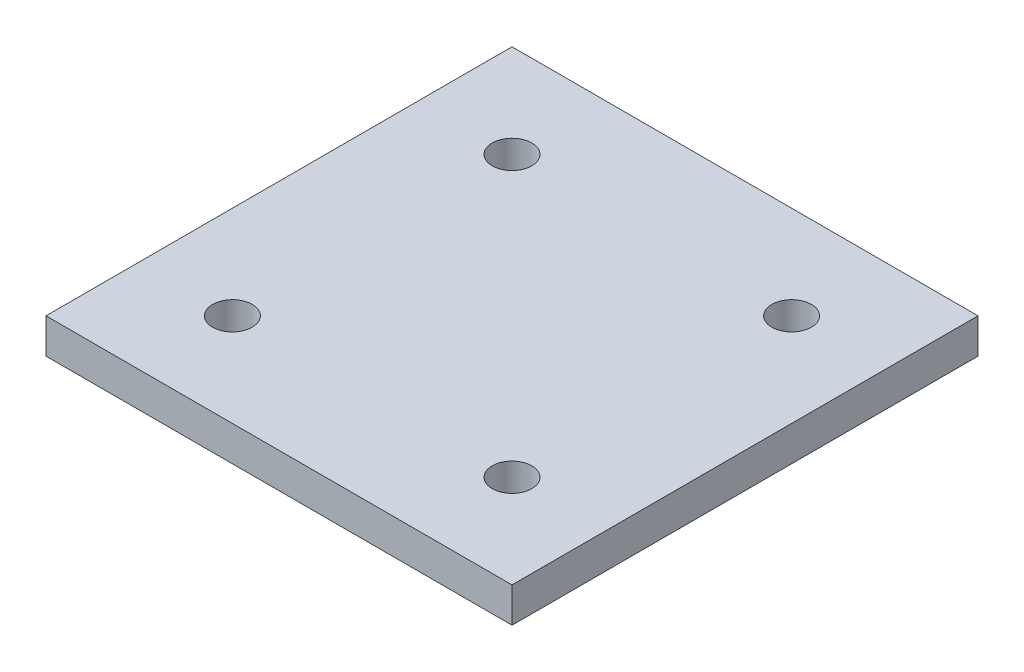
ISO-10303-21;
HEADER;
FILE_DESCRIPTION(('STEP AP214'),'2;1');
FILE_NAME('part.step','',(''),(''),'','','');
FILE_SCHEMA(('AUTOMOTIVE_DESIGN { 1 0 10303 214 1 1 1 1 }'));
ENDSEC;
DATA;
#1=APPLICATION_CONTEXT('core data for automotive mechanical design processes');
#2=APPLICATION_PROTOCOL_DEFINITION('international standard','automotive_design',2000,#1);
#3=PRODUCT_CONTEXT('',#1,'mechanical');
#4=PRODUCT('Part','Part','',(#3));
#5=PRODUCT_RELATED_PRODUCT_CATEGORY('part','',(#4));
#6=PRODUCT_DEFINITION_FORMATION('','',#4);
#7=PRODUCT_DEFINITION_CONTEXT('part definition',#1,'design');
#8=PRODUCT_DEFINITION('design','',#6,#7);
#9=PRODUCT_DEFINITION_SHAPE('','',#8);
#10=(LENGTH_UNIT() NAMED_UNIT(*) SI_UNIT(.MILLI.,.METRE.));
#11=(NAMED_UNIT(*) PLANE_ANGLE_UNIT() SI_UNIT($,.RADIAN.));
#12=(NAMED_UNIT(*) SI_UNIT($,.STERADIAN.) SOLID_ANGLE_UNIT());
#13=UNCERTAINTY_MEASURE_WITH_UNIT(LENGTH_MEASURE(1.E-05),#10,'distance_accuracy_value','');
#14=(GEOMETRIC_REPRESENTATION_CONTEXT(3) GLOBAL_UNCERTAINTY_ASSIGNED_CONTEXT((#13)) GLOBAL_UNIT_ASSIGNED_CONTEXT((#10,
#11,#12)) REPRESENTATION_CONTEXT('',''));
#15=CARTESIAN_POINT('',(0.,0.,0.));
#16=DIRECTION('',(0.,0.,1.));
#17=DIRECTION('',(1.,0.,0.));
#18=AXIS2_PLACEMENT_3D('',#15,#16,#17);
#19=CARTESIAN_POINT('',(-20.,3.,20.));
#20=DIRECTION('',(1.,0.,0.));
#21=DIRECTION('',(0.,0.,-1.));
#22=AXIS2_PLACEMENT_3D('',#19,#20,#21);
#23=PLANE('',#22);
#24=DIRECTION('',(0.,0.,1.));
#25=VECTOR('',#24,1.);
#26=CARTESIAN_POINT('',(-20.,0.,20.));
#27=LINE('',#26,#25);
#28=CARTESIAN_POINT('',(-20.,0.,-20.));
#29=VERTEX_POINT('',#28);
#30=CARTESIAN_POINT('',(-20.,0.,20.));
#31=VERTEX_POINT('',#30);
#32=EDGE_CURVE('E105',#29,#31,#27,.T.);
#33=ORIENTED_EDGE('',*,*,#32,.T.);
#34=DIRECTION('',(0.,-1.,0.));
#35=VECTOR('',#34,1.);
#36=CARTESIAN_POINT('',(-20.,3.,20.));
#37=LINE('',#36,#35);
#38=CARTESIAN_POINT('',(-20.,3.,20.));
#39=VERTEX_POINT('',#38);
#40=EDGE_CURVE('E11',#39,#31,#37,.T.);
#41=ORIENTED_EDGE('',*,*,#40,.F.);
#42=DIRECTION('',(0.,0.,1.));
#43=VECTOR('',#42,1.);
#44=CARTESIAN_POINT('',(-20.,3.,20.));
#45=LINE('',#44,#43);
#46=CARTESIAN_POINT('',(-20.,3.,-20.));
#47=VERTEX_POINT('',#46);
#48=EDGE_CURVE('E92',#47,#39,#45,.T.);
#49=ORIENTED_EDGE('',*,*,#48,.F.);
#50=DIRECTION('',(0.,-1.,0.));
#51=VECTOR('',#50,1.);
#52=CARTESIAN_POINT('',(-20.,3.,-20.));
#53=LINE('',#52,#51);
#54=EDGE_CURVE('E101',#47,#29,#53,.T.);
#55=ORIENTED_EDGE('',*,*,#54,.T.);
#56=EDGE_LOOP('',(#33,#41,#49,#55));
#57=FACE_BOUND('',#56,.T.);
#58=ADVANCED_FACE('F39',(#57),#23,.F.);
#59=CARTESIAN_POINT('',(-20.,3.,20.));
#60=DIRECTION('',(0.,0.,-1.));
#61=DIRECTION('',(-1.,0.,0.));
#62=AXIS2_PLACEMENT_3D('',#59,#60,#61);
#63=PLANE('',#62);
#64=DIRECTION('',(1.,0.,0.));
#65=VECTOR('',#64,1.);
#66=CARTESIAN_POINT('',(-20.,0.,20.));
#67=LINE('',#66,#65);
#68=CARTESIAN_POINT('',(20.,0.,20.));
#69=VERTEX_POINT('',#68);
#70=EDGE_CURVE('E96',#31,#69,#67,.T.);
#71=ORIENTED_EDGE('',*,*,#70,.T.);
#72=DIRECTION('',(0.,-1.,0.));
#73=VECTOR('',#72,1.);
#74=CARTESIAN_POINT('',(20.,3.,20.));
#75=LINE('',#74,#73);
#76=CARTESIAN_POINT('',(20.,3.,20.));
#77=VERTEX_POINT('',#76);
#78=EDGE_CURVE('E48',#77,#69,#75,.T.);
#79=ORIENTED_EDGE('',*,*,#78,.F.);
#80=DIRECTION('',(1.,0.,0.));
#81=VECTOR('',#80,1.);
#82=CARTESIAN_POINT('',(-20.,3.,20.));
#83=LINE('',#82,#81);
#84=EDGE_CURVE('E87',#39,#77,#83,.T.);
#85=ORIENTED_EDGE('',*,*,#84,.F.);
#86=ORIENTED_EDGE('',*,*,#40,.T.);
#87=EDGE_LOOP('',(#71,#79,#85,#86));
#88=FACE_BOUND('',#87,.T.);
#89=ADVANCED_FACE('F95',(#88),#63,.F.);
#90=CARTESIAN_POINT('',(20.,3.,20.));
#91=DIRECTION('',(-1.,0.,0.));
#92=DIRECTION('',(0.,0.,1.));
#93=AXIS2_PLACEMENT_3D('',#90,#91,#92);
#94=PLANE('',#93);
#95=DIRECTION('',(0.,0.,-1.));
#96=VECTOR('',#95,1.);
#97=CARTESIAN_POINT('',(20.,0.,20.));
#98=LINE('',#97,#96);
#99=CARTESIAN_POINT('',(20.,0.,-20.));
#100=VERTEX_POINT('',#99);
#101=EDGE_CURVE('E74',#69,#100,#98,.T.);
#102=ORIENTED_EDGE('',*,*,#101,.T.);
#103=DIRECTION('',(0.,-1.,0.));
#104=VECTOR('',#103,1.);
#105=CARTESIAN_POINT('',(20.,3.,-20.));
#106=LINE('',#105,#104);
#107=CARTESIAN_POINT('',(20.,3.,-20.));
#108=VERTEX_POINT('',#107);
#109=EDGE_CURVE('E97',#108,#100,#106,.T.);
#110=ORIENTED_EDGE('',*,*,#109,.F.);
#111=DIRECTION('',(0.,0.,-1.));
#112=VECTOR('',#111,1.);
#113=CARTESIAN_POINT('',(20.,3.,20.));
#114=LINE('',#113,#112);
#115=EDGE_CURVE('E90',#77,#108,#114,.T.);
#116=ORIENTED_EDGE('',*,*,#115,.F.);
#117=ORIENTED_EDGE('',*,*,#78,.T.);
#118=EDGE_LOOP('',(#102,#110,#116,#117));
#119=FACE_BOUND('',#118,.T.);
#120=ADVANCED_FACE('F99',(#119),#94,.F.);
#121=CARTESIAN_POINT('',(-20.,3.,-20.));
#122=DIRECTION('',(0.,0.,1.));
#123=DIRECTION('',(1.,0.,0.));
#124=AXIS2_PLACEMENT_3D('',#121,#122,#123);
#125=PLANE('',#124);
#126=DIRECTION('',(-1.,0.,0.));
#127=VECTOR('',#126,1.);
#128=CARTESIAN_POINT('',(-20.,0.,-20.));
#129=LINE('',#128,#127);
#130=EDGE_CURVE('E80',#100,#29,#129,.T.);
#131=ORIENTED_EDGE('',*,*,#130,.T.);
#132=ORIENTED_EDGE('',*,*,#54,.F.);
#133=DIRECTION('',(-1.,0.,0.));
#134=VECTOR('',#133,1.);
#135=CARTESIAN_POINT('',(-20.,3.,-20.));
#136=LINE('',#135,#134);
#137=EDGE_CURVE('E57',#108,#47,#136,.T.);
#138=ORIENTED_EDGE('',*,*,#137,.F.);
#139=ORIENTED_EDGE('',*,*,#109,.T.);
#140=EDGE_LOOP('',(#131,#132,#138,#139));
#141=FACE_BOUND('',#140,.T.);
#142=ADVANCED_FACE('F141',(#141),#125,.F.);
#143=CARTESIAN_POINT('',(0.,3.,0.));
#144=DIRECTION('',(0.,-1.,0.));
#145=DIRECTION('',(0.,0.,-1.));
#146=AXIS2_PLACEMENT_3D('',#143,#144,#145);
#147=PLANE('',#146);
#148=CARTESIAN_POINT('',(-12.,3.,-12.));
#149=DIRECTION('',(0.,1.,0.));
#150=DIRECTION('',(0.,0.,1.));
#151=AXIS2_PLACEMENT_3D('',#148,#149,#150);
#152=CIRCLE('',#151,1.7);
#153=CARTESIAN_POINT('',(-12.,3.,-10.3));
#154=VERTEX_POINT('',#153);
#155=EDGE_CURVE('E223',#154,#154,#152,.T.);
#156=ORIENTED_EDGE('',*,*,#155,.F.);
#157=EDGE_LOOP('',(#156));
#158=FACE_BOUND('',#157,.T.);
#159=CARTESIAN_POINT('',(12.,3.,12.));
#160=DIRECTION('',(0.,1.,0.));
#161=DIRECTION('',(0.,0.,1.));
#162=AXIS2_PLACEMENT_3D('',#159,#160,#161);
#163=CIRCLE('',#162,1.7);
#164=CARTESIAN_POINT('',(12.,3.,13.7));
#165=VERTEX_POINT('',#164);
#166=EDGE_CURVE('E221',#165,#165,#163,.T.);
#167=ORIENTED_EDGE('',*,*,#166,.F.);
#168=EDGE_LOOP('',(#167));
#169=FACE_BOUND('',#168,.T.);
#170=CARTESIAN_POINT('',(12.,3.,-12.));
#171=DIRECTION('',(0.,1.,0.));
#172=DIRECTION('',(0.,0.,1.));
#173=AXIS2_PLACEMENT_3D('',#170,#171,#172);
#174=CIRCLE('',#173,1.7);
#175=CARTESIAN_POINT('',(12.,3.,-10.3));
#176=VERTEX_POINT('',#175);
#177=EDGE_CURVE('E224',#176,#176,#174,.T.);
#178=ORIENTED_EDGE('',*,*,#177,.F.);
#179=EDGE_LOOP('',(#178));
#180=FACE_BOUND('',#179,.T.);
#181=CARTESIAN_POINT('',(-12.,3.,12.));
#182=DIRECTION('',(0.,1.,0.));
#183=DIRECTION('',(0.,0.,1.));
#184=AXIS2_PLACEMENT_3D('',#181,#182,#183);
#185=CIRCLE('',#184,1.7);
#186=CARTESIAN_POINT('',(-12.,3.,13.7));
#187=VERTEX_POINT('',#186);
#188=EDGE_CURVE('E117',#187,#187,#185,.T.);
#189=ORIENTED_EDGE('',*,*,#188,.F.);
#190=EDGE_LOOP('',(#189));
#191=FACE_BOUND('',#190,.T.);
#192=ORIENTED_EDGE('',*,*,#48,.T.);
#193=ORIENTED_EDGE('',*,*,#84,.T.);
#194=ORIENTED_EDGE('',*,*,#115,.T.);
#195=ORIENTED_EDGE('',*,*,#137,.T.);
#196=EDGE_LOOP('',(#192,#193,#194,#195));
#197=FACE_BOUND('',#196,.T.);
#198=ADVANCED_FACE('F88',(#158,#169,#180,#191,#197),#147,.F.);
#199=CARTESIAN_POINT('',(0.,0.,0.));
#200=DIRECTION('',(0.,-1.,0.));
#201=DIRECTION('',(0.,0.,-1.));
#202=AXIS2_PLACEMENT_3D('',#199,#200,#201);
#203=PLANE('',#202);
#204=CARTESIAN_POINT('',(-12.,0.,-12.));
#205=DIRECTION('',(0.,-1.,0.));
#206=DIRECTION('',(0.,0.,-1.));
#207=AXIS2_PLACEMENT_3D('',#204,#205,#206);
#208=CIRCLE('',#207,1.7);
#209=CARTESIAN_POINT('',(-12.,0.,-10.3));
#210=VERTEX_POINT('',#209);
#211=EDGE_CURVE('E42',#210,#210,#208,.T.);
#212=ORIENTED_EDGE('',*,*,#211,.F.);
#213=EDGE_LOOP('',(#212));
#214=FACE_BOUND('',#213,.T.);
#215=CARTESIAN_POINT('',(12.,0.,12.));
#216=DIRECTION('',(0.,-1.,0.));
#217=DIRECTION('',(0.,0.,-1.));
#218=AXIS2_PLACEMENT_3D('',#215,#216,#217);
#219=CIRCLE('',#218,1.7);
#220=CARTESIAN_POINT('',(12.,0.,13.7));
#221=VERTEX_POINT('',#220);
#222=EDGE_CURVE('E119',#221,#221,#219,.T.);
#223=ORIENTED_EDGE('',*,*,#222,.F.);
#224=EDGE_LOOP('',(#223));
#225=FACE_BOUND('',#224,.T.);
#226=CARTESIAN_POINT('',(12.,0.,-12.));
#227=DIRECTION('',(0.,-1.,0.));
#228=DIRECTION('',(0.,0.,-1.));
#229=AXIS2_PLACEMENT_3D('',#226,#227,#228);
#230=CIRCLE('',#229,1.7);
#231=CARTESIAN_POINT('',(12.,0.,-10.3));
#232=VERTEX_POINT('',#231);
#233=EDGE_CURVE('E116',#232,#232,#230,.T.);
#234=ORIENTED_EDGE('',*,*,#233,.F.);
#235=EDGE_LOOP('',(#234));
#236=FACE_BOUND('',#235,.T.);
#237=CARTESIAN_POINT('',(-12.,0.,12.));
#238=DIRECTION('',(0.,-1.,0.));
#239=DIRECTION('',(0.,0.,-1.));
#240=AXIS2_PLACEMENT_3D('',#237,#238,#239);
#241=CIRCLE('',#240,1.7);
#242=CARTESIAN_POINT('',(-12.,0.,13.7));
#243=VERTEX_POINT('',#242);
#244=EDGE_CURVE('E113',#243,#243,#241,.T.);
#245=ORIENTED_EDGE('',*,*,#244,.F.);
#246=EDGE_LOOP('',(#245));
#247=FACE_BOUND('',#246,.T.);
#248=ORIENTED_EDGE('',*,*,#32,.F.);
#249=ORIENTED_EDGE('',*,*,#130,.F.);
#250=ORIENTED_EDGE('',*,*,#101,.F.);
#251=ORIENTED_EDGE('',*,*,#70,.F.);
#252=EDGE_LOOP('',(#248,#249,#250,#251));
#253=FACE_BOUND('',#252,.T.);
#254=ADVANCED_FACE('F129',(#214,#225,#236,#247,#253),#203,.T.);
#255=CARTESIAN_POINT('',(-12.,-1.2E-05,12.));
#256=DIRECTION('',(0.,1.,0.));
#257=DIRECTION('',(0.,0.,1.));
#258=AXIS2_PLACEMENT_3D('',#255,#256,#257);
#259=CYLINDRICAL_SURFACE('',#258,1.7);
#260=CARTESIAN_POINT('',(-12.,0.,13.7));
#261=CARTESIAN_POINT('',(-12.,0.03125,13.7));
#262=CARTESIAN_POINT('',(-12.,0.0625,13.7));
#263=CARTESIAN_POINT('',(-12.,0.125,13.7));
#264=CARTESIAN_POINT('',(-12.,0.15625,13.7));
#265=CARTESIAN_POINT('',(-12.,0.21875,13.7));
#266=CARTESIAN_POINT('',(-12.,0.25,13.7));
#267=CARTESIAN_POINT('',(-12.,0.3125,13.7));
#268=CARTESIAN_POINT('',(-12.,0.34375,13.7));
#269=CARTESIAN_POINT('',(-12.,0.40625,13.7));
#270=CARTESIAN_POINT('',(-12.,0.4375,13.7));
#271=CARTESIAN_POINT('',(-12.,0.5,13.7));
#272=CARTESIAN_POINT('',(-12.,0.53125,13.7));
#273=CARTESIAN_POINT('',(-12.,0.59375,13.7));
#274=CARTESIAN_POINT('',(-12.,0.625,13.7));
#275=CARTESIAN_POINT('',(-12.,0.6875,13.7));
#276=CARTESIAN_POINT('',(-12.,0.71875,13.7));
#277=CARTESIAN_POINT('',(-12.,0.78125,13.7));
#278=CARTESIAN_POINT('',(-12.,0.8125,13.7));
#279=CARTESIAN_POINT('',(-12.,0.875,13.7));
#280=CARTESIAN_POINT('',(-12.,0.90625,13.7));
#281=CARTESIAN_POINT('',(-12.,0.96875,13.7));
#282=CARTESIAN_POINT('',(-12.,1.,13.7));
#283=CARTESIAN_POINT('',(-12.,1.0625,13.7));
#284=CARTESIAN_POINT('',(-12.,1.09375,13.7));
#285=CARTESIAN_POINT('',(-12.,1.15625,13.7));
#286=CARTESIAN_POINT('',(-12.,1.1875,13.7));
#287=CARTESIAN_POINT('',(-12.,1.25,13.7));
#288=CARTESIAN_POINT('',(-12.,1.28125,13.7));
#289=CARTESIAN_POINT('',(-12.,1.34375,13.7));
#290=CARTESIAN_POINT('',(-12.,1.375,13.7));
#291=CARTESIAN_POINT('',(-12.,1.4375,13.7));
#292=CARTESIAN_POINT('',(-12.,1.46875,13.7));
#293=CARTESIAN_POINT('',(-12.,1.53125,13.7));
#294=CARTESIAN_POINT('',(-12.,1.5625,13.7));
#295=CARTESIAN_POINT('',(-12.,1.625,13.7));
#296=CARTESIAN_POINT('',(-12.,1.65625,13.7));
#297=CARTESIAN_POINT('',(-12.,1.71875,13.7));
#298=CARTESIAN_POINT('',(-12.,1.75,13.7));
#299=CARTESIAN_POINT('',(-12.,1.8125,13.7));
#300=CARTESIAN_POINT('',(-12.,1.84375,13.7));
#301=CARTESIAN_POINT('',(-12.,1.90625,13.7));
#302=CARTESIAN_POINT('',(-12.,1.9375,13.7));
#303=CARTESIAN_POINT('',(-12.,2.,13.7));
#304=CARTESIAN_POINT('',(-12.,2.03125,13.7));
#305=CARTESIAN_POINT('',(-12.,2.09375,13.7));
#306=CARTESIAN_POINT('',(-12.,2.125,13.7));
#307=CARTESIAN_POINT('',(-12.,2.1875,13.7));
#308=CARTESIAN_POINT('',(-12.,2.21875,13.7));
#309=CARTESIAN_POINT('',(-12.,2.28125,13.7));
#310=CARTESIAN_POINT('',(-12.,2.3125,13.7));
#311=CARTESIAN_POINT('',(-12.,2.375,13.7));
#312=CARTESIAN_POINT('',(-12.,2.40625,13.7));
#313=CARTESIAN_POINT('',(-12.,2.46875,13.7));
#314=CARTESIAN_POINT('',(-12.,2.5,13.7));
#315=CARTESIAN_POINT('',(-12.,2.5625,13.7));
#316=CARTESIAN_POINT('',(-12.,2.59375,13.7));
#317=CARTESIAN_POINT('',(-12.,2.65625,13.7));
#318=CARTESIAN_POINT('',(-12.,2.6875,13.7));
#319=CARTESIAN_POINT('',(-12.,2.75,13.7));
#320=CARTESIAN_POINT('',(-12.,2.78125,13.7));
#321=CARTESIAN_POINT('',(-12.,2.84375,13.7));
#322=CARTESIAN_POINT('',(-12.,2.875,13.7));
#323=CARTESIAN_POINT('',(-12.,2.9375,13.7));
#324=CARTESIAN_POINT('',(-12.,2.96875,13.7));
#325=CARTESIAN_POINT('',(-12.,3.,13.7));
#326=B_SPLINE_CURVE_WITH_KNOTS('',3,(#260,#261,#262,#263,#264,#265,#266,#267,#268,#269,#270,
#271,#272,#273,#274,#275,#276,#277,#278,#279,#280,#281,#282,#283,#284,#285,#286,#287,#288,#289,
#290,#291,#292,#293,#294,#295,#296,#297,#298,#299,#300,#301,#302,#303,#304,#305,#306,#307,#308,
#309,#310,#311,#312,#313,#314,#315,#316,#317,#318,#319,#320,#321,#322,#323,#324,#325),
.UNSPECIFIED.,.F.,.F.,(4,2,2,2,2,2,2,2,2,2,2,2,2,2,2,2,2,2,2,2,2,2,2,2,2,2,2,2,2,2,2,2,4),(0.,
0.09375,0.1875,0.28125,0.375,0.46875,0.5625,0.65625,0.75,0.84375,0.9375,1.03125,1.125,1.21875,
1.3125,1.40625,1.5,1.59375,1.6875,1.78125,1.875,1.96875,2.0625,2.15625,2.25,2.34375,2.4375,
2.53125,2.625,2.71875,2.8125,2.90625,3.),.UNSPECIFIED.);
#327=EDGE_CURVE('BSEAM132',#243,#187,#326,.T.);
#328=ORIENTED_EDGE('',*,*,#244,.T.);
#329=ORIENTED_EDGE('',*,*,#188,.T.);
#330=ORIENTED_EDGE('',*,*,#327,.T.);
#331=ORIENTED_EDGE('',*,*,#327,.F.);
#332=EDGE_LOOP('',(#328,#330,#329,#331));
#333=FACE_BOUND('',#332,.T.);
#334=ADVANCED_FACE('F132',(#333),#259,.F.);
#335=CARTESIAN_POINT('',(12.,-1.2E-05,-12.));
#336=DIRECTION('',(0.,1.,0.));
#337=DIRECTION('',(0.,0.,1.));
#338=AXIS2_PLACEMENT_3D('',#335,#336,#337);
#339=CYLINDRICAL_SURFACE('',#338,1.7);
#340=CARTESIAN_POINT('',(12.,0.,-10.3));
#341=CARTESIAN_POINT('',(12.,0.03125,-10.3));
#342=CARTESIAN_POINT('',(12.,0.0625,-10.3));
#343=CARTESIAN_POINT('',(12.,0.125,-10.3));
#344=CARTESIAN_POINT('',(12.,0.15625,-10.3));
#345=CARTESIAN_POINT('',(12.,0.21875,-10.3));
#346=CARTESIAN_POINT('',(12.,0.25,-10.3));
#347=CARTESIAN_POINT('',(12.,0.3125,-10.3));
#348=CARTESIAN_POINT('',(12.,0.34375,-10.3));
#349=CARTESIAN_POINT('',(12.,0.40625,-10.3));
#350=CARTESIAN_POINT('',(12.,0.4375,-10.3));
#351=CARTESIAN_POINT('',(12.,0.5,-10.3));
#352=CARTESIAN_POINT('',(12.,0.53125,-10.3));
#353=CARTESIAN_POINT('',(12.,0.59375,-10.3));
#354=CARTESIAN_POINT('',(12.,0.625,-10.3));
#355=CARTESIAN_POINT('',(12.,0.6875,-10.3));
#356=CARTESIAN_POINT('',(12.,0.71875,-10.3));
#357=CARTESIAN_POINT('',(12.,0.78125,-10.3));
#358=CARTESIAN_POINT('',(12.,0.8125,-10.3));
#359=CARTESIAN_POINT('',(12.,0.875,-10.3));
#360=CARTESIAN_POINT('',(12.,0.90625,-10.3));
#361=CARTESIAN_POINT('',(12.,0.96875,-10.3));
#362=CARTESIAN_POINT('',(12.,1.,-10.3));
#363=CARTESIAN_POINT('',(12.,1.0625,-10.3));
#364=CARTESIAN_POINT('',(12.,1.09375,-10.3));
#365=CARTESIAN_POINT('',(12.,1.15625,-10.3));
#366=CARTESIAN_POINT('',(12.,1.1875,-10.3));
#367=CARTESIAN_POINT('',(12.,1.25,-10.3));
#368=CARTESIAN_POINT('',(12.,1.28125,-10.3));
#369=CARTESIAN_POINT('',(12.,1.34375,-10.3));
#370=CARTESIAN_POINT('',(12.,1.375,-10.3));
#371=CARTESIAN_POINT('',(12.,1.4375,-10.3));
#372=CARTESIAN_POINT('',(12.,1.46875,-10.3));
#373=CARTESIAN_POINT('',(12.,1.53125,-10.3));
#374=CARTESIAN_POINT('',(12.,1.5625,-10.3));
#375=CARTESIAN_POINT('',(12.,1.625,-10.3));
#376=CARTESIAN_POINT('',(12.,1.65625,-10.3));
#377=CARTESIAN_POINT('',(12.,1.71875,-10.3));
#378=CARTESIAN_POINT('',(12.,1.75,-10.3));
#379=CARTESIAN_POINT('',(12.,1.8125,-10.3));
#380=CARTESIAN_POINT('',(12.,1.84375,-10.3));
#381=CARTESIAN_POINT('',(12.,1.90625,-10.3));
#382=CARTESIAN_POINT('',(12.,1.9375,-10.3));
#383=CARTESIAN_POINT('',(12.,2.,-10.3));
#384=CARTESIAN_POINT('',(12.,2.03125,-10.3));
#385=CARTESIAN_POINT('',(12.,2.09375,-10.3));
#386=CARTESIAN_POINT('',(12.,2.125,-10.3));
#387=CARTESIAN_POINT('',(12.,2.1875,-10.3));
#388=CARTESIAN_POINT('',(12.,2.21875,-10.3));
#389=CARTESIAN_POINT('',(12.,2.28125,-10.3));
#390=CARTESIAN_POINT('',(12.,2.3125,-10.3));
#391=CARTESIAN_POINT('',(12.,2.375,-10.3));
#392=CARTESIAN_POINT('',(12.,2.40625,-10.3));
#393=CARTESIAN_POINT('',(12.,2.46875,-10.3));
#394=CARTESIAN_POINT('',(12.,2.5,-10.3));
#395=CARTESIAN_POINT('',(12.,2.5625,-10.3));
#396=CARTESIAN_POINT('',(12.,2.59375,-10.3));
#397=CARTESIAN_POINT('',(12.,2.65625,-10.3));
#398=CARTESIAN_POINT('',(12.,2.6875,-10.3));
#399=CARTESIAN_POINT('',(12.,2.75,-10.3));
#400=CARTESIAN_POINT('',(12.,2.78125,-10.3));
#401=CARTESIAN_POINT('',(12.,2.84375,-10.3));
#402=CARTESIAN_POINT('',(12.,2.875,-10.3));
#403=CARTESIAN_POINT('',(12.,2.9375,-10.3));
#404=CARTESIAN_POINT('',(12.,2.96875,-10.3));
#405=CARTESIAN_POINT('',(12.,3.,-10.3));
#406=B_SPLINE_CURVE_WITH_KNOTS('',3,(#340,#341,#342,#343,#344,#345,#346,#347,#348,#349,#350,
#351,#352,#353,#354,#355,#356,#357,#358,#359,#360,#361,#362,#363,#364,#365,#366,#367,#368,#369,
#370,#371,#372,#373,#374,#375,#376,#377,#378,#379,#380,#381,#382,#383,#384,#385,#386,#387,#388,
#389,#390,#391,#392,#393,#394,#395,#396,#397,#398,#399,#400,#401,#402,#403,#404,#405),
.UNSPECIFIED.,.F.,.F.,(4,2,2,2,2,2,2,2,2,2,2,2,2,2,2,2,2,2,2,2,2,2,2,2,2,2,2,2,2,2,2,2,4),(0.,
0.09375,0.1875,0.28125,0.375,0.46875,0.5625,0.65625,0.75,0.84375,0.9375,1.03125,1.125,1.21875,
1.3125,1.40625,1.5,1.59375,1.6875,1.78125,1.875,1.96875,2.0625,2.15625,2.25,2.34375,2.4375,
2.53125,2.625,2.71875,2.8125,2.90625,3.),.UNSPECIFIED.);
#407=EDGE_CURVE('BSEAM188',#232,#176,#406,.T.);
#408=ORIENTED_EDGE('',*,*,#233,.T.);
#409=ORIENTED_EDGE('',*,*,#177,.T.);
#410=ORIENTED_EDGE('',*,*,#407,.T.);
#411=ORIENTED_EDGE('',*,*,#407,.F.);
#412=EDGE_LOOP('',(#408,#410,#409,#411));
#413=FACE_BOUND('',#412,.T.);
#414=ADVANCED_FACE('F188',(#413),#339,.F.);
#415=CARTESIAN_POINT('',(12.,-1.2E-05,12.));
#416=DIRECTION('',(0.,1.,0.));
#417=DIRECTION('',(0.,0.,1.));
#418=AXIS2_PLACEMENT_3D('',#415,#416,#417);
#419=CYLINDRICAL_SURFACE('',#418,1.7);
#420=CARTESIAN_POINT('',(12.,0.,13.7));
#421=CARTESIAN_POINT('',(12.,0.03125,13.7));
#422=CARTESIAN_POINT('',(12.,0.0625,13.7));
#423=CARTESIAN_POINT('',(12.,0.125,13.7));
#424=CARTESIAN_POINT('',(12.,0.15625,13.7));
#425=CARTESIAN_POINT('',(12.,0.21875,13.7));
#426=CARTESIAN_POINT('',(12.,0.25,13.7));
#427=CARTESIAN_POINT('',(12.,0.3125,13.7));
#428=CARTESIAN_POINT('',(12.,0.34375,13.7));
#429=CARTESIAN_POINT('',(12.,0.40625,13.7));
#430=CARTESIAN_POINT('',(12.,0.4375,13.7));
#431=CARTESIAN_POINT('',(12.,0.5,13.7));
#432=CARTESIAN_POINT('',(12.,0.53125,13.7));
#433=CARTESIAN_POINT('',(12.,0.59375,13.7));
#434=CARTESIAN_POINT('',(12.,0.625,13.7));
#435=CARTESIAN_POINT('',(12.,0.6875,13.7));
#436=CARTESIAN_POINT('',(12.,0.71875,13.7));
#437=CARTESIAN_POINT('',(12.,0.78125,13.7));
#438=CARTESIAN_POINT('',(12.,0.8125,13.7));
#439=CARTESIAN_POINT('',(12.,0.875,13.7));
#440=CARTESIAN_POINT('',(12.,0.90625,13.7));
#441=CARTESIAN_POINT('',(12.,0.96875,13.7));
#442=CARTESIAN_POINT('',(12.,1.,13.7));
#443=CARTESIAN_POINT('',(12.,1.0625,13.7));
#444=CARTESIAN_POINT('',(12.,1.09375,13.7));
#445=CARTESIAN_POINT('',(12.,1.15625,13.7));
#446=CARTESIAN_POINT('',(12.,1.1875,13.7));
#447=CARTESIAN_POINT('',(12.,1.25,13.7));
#448=CARTESIAN_POINT('',(12.,1.28125,13.7));
#449=CARTESIAN_POINT('',(12.,1.34375,13.7));
#450=CARTESIAN_POINT('',(12.,1.375,13.7));
#451=CARTESIAN_POINT('',(12.,1.4375,13.7));
#452=CARTESIAN_POINT('',(12.,1.46875,13.7));
#453=CARTESIAN_POINT('',(12.,1.53125,13.7));
#454=CARTESIAN_POINT('',(12.,1.5625,13.7));
#455=CARTESIAN_POINT('',(12.,1.625,13.7));
#456=CARTESIAN_POINT('',(12.,1.65625,13.7));
#457=CARTESIAN_POINT('',(12.,1.71875,13.7));
#458=CARTESIAN_POINT('',(12.,1.75,13.7));
#459=CARTESIAN_POINT('',(12.,1.8125,13.7));
#460=CARTESIAN_POINT('',(12.,1.84375,13.7));
#461=CARTESIAN_POINT('',(12.,1.90625,13.7));
#462=CARTESIAN_POINT('',(12.,1.9375,13.7));
#463=CARTESIAN_POINT('',(12.,2.,13.7));
#464=CARTESIAN_POINT('',(12.,2.03125,13.7));
#465=CARTESIAN_POINT('',(12.,2.09375,13.7));
#466=CARTESIAN_POINT('',(12.,2.125,13.7));
#467=CARTESIAN_POINT('',(12.,2.1875,13.7));
#468=CARTESIAN_POINT('',(12.,2.21875,13.7));
#469=CARTESIAN_POINT('',(12.,2.28125,13.7));
#470=CARTESIAN_POINT('',(12.,2.3125,13.7));
#471=CARTESIAN_POINT('',(12.,2.375,13.7));
#472=CARTESIAN_POINT('',(12.,2.40625,13.7));
#473=CARTESIAN_POINT('',(12.,2.46875,13.7));
#474=CARTESIAN_POINT('',(12.,2.5,13.7));
#475=CARTESIAN_POINT('',(12.,2.5625,13.7));
#476=CARTESIAN_POINT('',(12.,2.59375,13.7));
#477=CARTESIAN_POINT('',(12.,2.65625,13.7));
#478=CARTESIAN_POINT('',(12.,2.6875,13.7));
#479=CARTESIAN_POINT('',(12.,2.75,13.7));
#480=CARTESIAN_POINT('',(12.,2.78125,13.7));
#481=CARTESIAN_POINT('',(12.,2.84375,13.7));
#482=CARTESIAN_POINT('',(12.,2.875,13.7));
#483=CARTESIAN_POINT('',(12.,2.9375,13.7));
#484=CARTESIAN_POINT('',(12.,2.96875,13.7));
#485=CARTESIAN_POINT('',(12.,3.,13.7));
#486=B_SPLINE_CURVE_WITH_KNOTS('',3,(#420,#421,#422,#423,#424,#425,#426,#427,#428,#429,#430,
#431,#432,#433,#434,#435,#436,#437,#438,#439,#440,#441,#442,#443,#444,#445,#446,#447,#448,#449,
#450,#451,#452,#453,#454,#455,#456,#457,#458,#459,#460,#461,#462,#463,#464,#465,#466,#467,#468,
#469,#470,#471,#472,#473,#474,#475,#476,#477,#478,#479,#480,#481,#482,#483,#484,#485),
.UNSPECIFIED.,.F.,.F.,(4,2,2,2,2,2,2,2,2,2,2,2,2,2,2,2,2,2,2,2,2,2,2,2,2,2,2,2,2,2,2,2,4),(0.,
0.09375,0.1875,0.28125,0.375,0.46875,0.5625,0.65625,0.75,0.84375,0.9375,1.03125,1.125,1.21875,
1.3125,1.40625,1.5,1.59375,1.6875,1.78125,1.875,1.96875,2.0625,2.15625,2.25,2.34375,2.4375,
2.53125,2.625,2.71875,2.8125,2.90625,3.),.UNSPECIFIED.);
#487=EDGE_CURVE('BSEAM198',#221,#165,#486,.T.);
#488=ORIENTED_EDGE('',*,*,#222,.T.);
#489=ORIENTED_EDGE('',*,*,#166,.T.);
#490=ORIENTED_EDGE('',*,*,#487,.T.);
#491=ORIENTED_EDGE('',*,*,#487,.F.);
#492=EDGE_LOOP('',(#488,#490,#489,#491));
#493=FACE_BOUND('',#492,.T.);
#494=ADVANCED_FACE('F198',(#493),#419,.F.);
#495=CARTESIAN_POINT('',(-12.,-1.2E-05,-12.));
#496=DIRECTION('',(0.,1.,0.));
#497=DIRECTION('',(0.,0.,1.));
#498=AXIS2_PLACEMENT_3D('',#495,#496,#497);
#499=CYLINDRICAL_SURFACE('',#498,1.7);
#500=CARTESIAN_POINT('',(-12.,0.,-10.3));
#501=CARTESIAN_POINT('',(-12.,0.03125,-10.3));
#502=CARTESIAN_POINT('',(-12.,0.0625,-10.3));
#503=CARTESIAN_POINT('',(-12.,0.125,-10.3));
#504=CARTESIAN_POINT('',(-12.,0.15625,-10.3));
#505=CARTESIAN_POINT('',(-12.,0.21875,-10.3));
#506=CARTESIAN_POINT('',(-12.,0.25,-10.3));
#507=CARTESIAN_POINT('',(-12.,0.3125,-10.3));
#508=CARTESIAN_POINT('',(-12.,0.34375,-10.3));
#509=CARTESIAN_POINT('',(-12.,0.40625,-10.3));
#510=CARTESIAN_POINT('',(-12.,0.4375,-10.3));
#511=CARTESIAN_POINT('',(-12.,0.5,-10.3));
#512=CARTESIAN_POINT('',(-12.,0.53125,-10.3));
#513=CARTESIAN_POINT('',(-12.,0.59375,-10.3));
#514=CARTESIAN_POINT('',(-12.,0.625,-10.3));
#515=CARTESIAN_POINT('',(-12.,0.6875,-10.3));
#516=CARTESIAN_POINT('',(-12.,0.71875,-10.3));
#517=CARTESIAN_POINT('',(-12.,0.78125,-10.3));
#518=CARTESIAN_POINT('',(-12.,0.8125,-10.3));
#519=CARTESIAN_POINT('',(-12.,0.875,-10.3));
#520=CARTESIAN_POINT('',(-12.,0.90625,-10.3));
#521=CARTESIAN_POINT('',(-12.,0.96875,-10.3));
#522=CARTESIAN_POINT('',(-12.,1.,-10.3));
#523=CARTESIAN_POINT('',(-12.,1.0625,-10.3));
#524=CARTESIAN_POINT('',(-12.,1.09375,-10.3));
#525=CARTESIAN_POINT('',(-12.,1.15625,-10.3));
#526=CARTESIAN_POINT('',(-12.,1.1875,-10.3));
#527=CARTESIAN_POINT('',(-12.,1.25,-10.3));
#528=CARTESIAN_POINT('',(-12.,1.28125,-10.3));
#529=CARTESIAN_POINT('',(-12.,1.34375,-10.3));
#530=CARTESIAN_POINT('',(-12.,1.375,-10.3));
#531=CARTESIAN_POINT('',(-12.,1.4375,-10.3));
#532=CARTESIAN_POINT('',(-12.,1.46875,-10.3));
#533=CARTESIAN_POINT('',(-12.,1.53125,-10.3));
#534=CARTESIAN_POINT('',(-12.,1.5625,-10.3));
#535=CARTESIAN_POINT('',(-12.,1.625,-10.3));
#536=CARTESIAN_POINT('',(-12.,1.65625,-10.3));
#537=CARTESIAN_POINT('',(-12.,1.71875,-10.3));
#538=CARTESIAN_POINT('',(-12.,1.75,-10.3));
#539=CARTESIAN_POINT('',(-12.,1.8125,-10.3));
#540=CARTESIAN_POINT('',(-12.,1.84375,-10.3));
#541=CARTESIAN_POINT('',(-12.,1.90625,-10.3));
#542=CARTESIAN_POINT('',(-12.,1.9375,-10.3));
#543=CARTESIAN_POINT('',(-12.,2.,-10.3));
#544=CARTESIAN_POINT('',(-12.,2.03125,-10.3));
#545=CARTESIAN_POINT('',(-12.,2.09375,-10.3));
#546=CARTESIAN_POINT('',(-12.,2.125,-10.3));
#547=CARTESIAN_POINT('',(-12.,2.1875,-10.3));
#548=CARTESIAN_POINT('',(-12.,2.21875,-10.3));
#549=CARTESIAN_POINT('',(-12.,2.28125,-10.3));
#550=CARTESIAN_POINT('',(-12.,2.3125,-10.3));
#551=CARTESIAN_POINT('',(-12.,2.375,-10.3));
#552=CARTESIAN_POINT('',(-12.,2.40625,-10.3));
#553=CARTESIAN_POINT('',(-12.,2.46875,-10.3));
#554=CARTESIAN_POINT('',(-12.,2.5,-10.3));
#555=CARTESIAN_POINT('',(-12.,2.5625,-10.3));
#556=CARTESIAN_POINT('',(-12.,2.59375,-10.3));
#557=CARTESIAN_POINT('',(-12.,2.65625,-10.3));
#558=CARTESIAN_POINT('',(-12.,2.6875,-10.3));
#559=CARTESIAN_POINT('',(-12.,2.75,-10.3));
#560=CARTESIAN_POINT('',(-12.,2.78125,-10.3));
#561=CARTESIAN_POINT('',(-12.,2.84375,-10.3));
#562=CARTESIAN_POINT('',(-12.,2.875,-10.3));
#563=CARTESIAN_POINT('',(-12.,2.9375,-10.3));
#564=CARTESIAN_POINT('',(-12.,2.96875,-10.3));
#565=CARTESIAN_POINT('',(-12.,3.,-10.3));
#566=B_SPLINE_CURVE_WITH_KNOTS('',3,(#500,#501,#502,#503,#504,#505,#506,#507,#508,#509,#510,
#511,#512,#513,#514,#515,#516,#517,#518,#519,#520,#521,#522,#523,#524,#525,#526,#527,#528,#529,
#530,#531,#532,#533,#534,#535,#536,#537,#538,#539,#540,#541,#542,#543,#544,#545,#546,#547,#548,
#549,#550,#551,#552,#553,#554,#555,#556,#557,#558,#559,#560,#561,#562,#563,#564,#565),
.UNSPECIFIED.,.F.,.F.,(4,2,2,2,2,2,2,2,2,2,2,2,2,2,2,2,2,2,2,2,2,2,2,2,2,2,2,2,2,2,2,2,4),(0.,
0.09375,0.1875,0.28125,0.375,0.46875,0.5625,0.65625,0.75,0.84375,0.9375,1.03125,1.125,1.21875,
1.3125,1.40625,1.5,1.59375,1.6875,1.78125,1.875,1.96875,2.0625,2.15625,2.25,2.34375,2.4375,
2.53125,2.625,2.71875,2.8125,2.90625,3.),.UNSPECIFIED.);
#567=EDGE_CURVE('BSEAM126',#210,#154,#566,.T.);
#568=ORIENTED_EDGE('',*,*,#211,.T.);
#569=ORIENTED_EDGE('',*,*,#155,.T.);
#570=ORIENTED_EDGE('',*,*,#567,.T.);
#571=ORIENTED_EDGE('',*,*,#567,.F.);
#572=EDGE_LOOP('',(#568,#570,#569,#571));
#573=FACE_BOUND('',#572,.T.);
#574=ADVANCED_FACE('F126',(#573),#499,.F.);
#575=CLOSED_SHELL('',(#58,#89,#120,#142,#198,#254,#334,#414,#494,#574));
#576=MANIFOLD_SOLID_BREP('B2',#575);
#577=ADVANCED_BREP_SHAPE_REPRESENTATION('',(#18,#576),#14);
#578=SHAPE_DEFINITION_REPRESENTATION(#9,#577);
ENDSEC;
END-ISO-10303-21;
